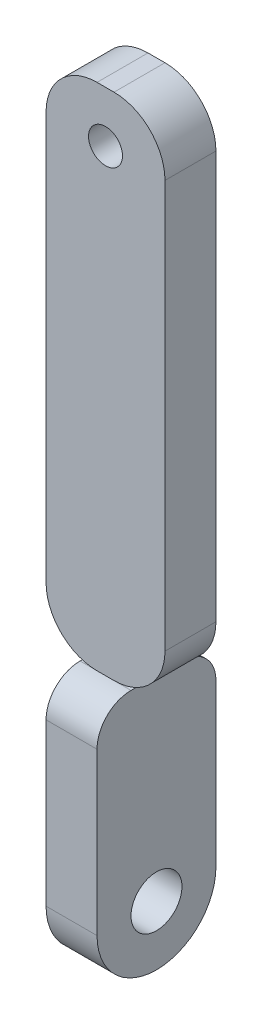
ISO-10303-21;
HEADER;
FILE_DESCRIPTION(('STEP AP214'),'2;1');
FILE_NAME('part.step','',(''),(''),'','','');
FILE_SCHEMA(('AUTOMOTIVE_DESIGN { 1 0 10303 214 1 1 1 1 }'));
ENDSEC;
DATA;
#1=APPLICATION_CONTEXT('core data for automotive mechanical design processes');
#2=APPLICATION_PROTOCOL_DEFINITION('international standard','automotive_design',2000,#1);
#3=PRODUCT_CONTEXT('',#1,'mechanical');
#4=PRODUCT('Part','Part','',(#3));
#5=PRODUCT_RELATED_PRODUCT_CATEGORY('part','',(#4));
#6=PRODUCT_DEFINITION_FORMATION('','',#4);
#7=PRODUCT_DEFINITION_CONTEXT('part definition',#1,'design');
#8=PRODUCT_DEFINITION('design','',#6,#7);
#9=PRODUCT_DEFINITION_SHAPE('','',#8);
#10=(LENGTH_UNIT() NAMED_UNIT(*) SI_UNIT(.MILLI.,.METRE.));
#11=(NAMED_UNIT(*) PLANE_ANGLE_UNIT() SI_UNIT($,.RADIAN.));
#12=(NAMED_UNIT(*) SI_UNIT($,.STERADIAN.) SOLID_ANGLE_UNIT());
#13=UNCERTAINTY_MEASURE_WITH_UNIT(LENGTH_MEASURE(1.E-05),#10,'distance_accuracy_value','');
#14=(GEOMETRIC_REPRESENTATION_CONTEXT(3) GLOBAL_UNCERTAINTY_ASSIGNED_CONTEXT((#13)) GLOBAL_UNIT_ASSIGNED_CONTEXT((#10,
#11,#12)) REPRESENTATION_CONTEXT('',''));
#15=CARTESIAN_POINT('',(0.,0.,0.));
#16=DIRECTION('',(0.,0.,1.));
#17=DIRECTION('',(1.,0.,0.));
#18=AXIS2_PLACEMENT_3D('',#15,#16,#17);
#19=CARTESIAN_POINT('',(0.,-30.,3.5));
#20=DIRECTION('',(0.,1.,0.));
#21=DIRECTION('',(0.,0.,1.));
#22=AXIS2_PLACEMENT_3D('',#19,#20,#21);
#23=PLANE('',#22);
#24=DIRECTION('',(0.,0.,-1.));
#25=VECTOR('',#24,1.);
#26=CARTESIAN_POINT('',(5.,-30.,3.5));
#27=LINE('',#26,#25);
#28=CARTESIAN_POINT('',(5.,-30.,1.5));
#29=VERTEX_POINT('',#28);
#30=CARTESIAN_POINT('',(5.,-30.,-1.5));
#31=VERTEX_POINT('',#30);
#32=EDGE_CURVE('E150',#29,#31,#27,.T.);
#33=ORIENTED_EDGE('',*,*,#32,.T.);
#34=DIRECTION('',(1.,0.,0.));
#35=VECTOR('',#34,1.);
#36=CARTESIAN_POINT('',(2.,-30.,-1.5));
#37=LINE('',#36,#35);
#38=CARTESIAN_POINT('',(4.,-30.,-1.5));
#39=VERTEX_POINT('',#38);
#40=EDGE_CURVE('E145',#31,#39,#37,.F.);
#41=ORIENTED_EDGE('',*,*,#40,.T.);
#42=DIRECTION('',(0.,0.,-1.));
#43=VECTOR('',#42,1.);
#44=CARTESIAN_POINT('',(4.,-30.,1.5));
#45=LINE('',#44,#43);
#46=CARTESIAN_POINT('',(4.,-30.,1.5));
#47=VERTEX_POINT('',#46);
#48=EDGE_CURVE('E147',#47,#39,#45,.T.);
#49=ORIENTED_EDGE('',*,*,#48,.F.);
#50=DIRECTION('',(1.,0.,0.));
#51=VECTOR('',#50,1.);
#52=CARTESIAN_POINT('',(0.,-30.,1.5));
#53=LINE('',#52,#51);
#54=EDGE_CURVE('E206',#47,#29,#53,.T.);
#55=ORIENTED_EDGE('',*,*,#54,.T.);
#56=EDGE_LOOP('',(#33,#41,#49,#55));
#57=FACE_BOUND('',#56,.T.);
#58=ADVANCED_FACE('F35',(#57),#23,.T.);
#59=CARTESIAN_POINT('',(0.,0.,1.5));
#60=DIRECTION('',(0.,1.,0.));
#61=DIRECTION('',(0.,0.,1.));
#62=AXIS2_PLACEMENT_3D('',#59,#60,#61);
#63=PLANE('',#62);
#64=DIRECTION('',(1.,0.,0.));
#65=VECTOR('',#64,1.);
#66=CARTESIAN_POINT('',(0.,0.,-1.5));
#67=LINE('',#66,#65);
#68=CARTESIAN_POINT('',(3.00000000000002,0.,-1.5));
#69=VERTEX_POINT('',#68);
#70=CARTESIAN_POINT('',(4.,0.,-1.5));
#71=VERTEX_POINT('',#70);
#72=EDGE_CURVE('E284',#69,#71,#67,.T.);
#73=ORIENTED_EDGE('',*,*,#72,.F.);
#74=DIRECTION('',(0.,0.,-1.));
#75=VECTOR('',#74,1.);
#76=CARTESIAN_POINT('',(3.00000000000002,0.,1.5));
#77=LINE('',#76,#75);
#78=CARTESIAN_POINT('',(3.00000000000002,0.,1.5));
#79=VERTEX_POINT('',#78);
#80=EDGE_CURVE('E204',#79,#69,#77,.T.);
#81=ORIENTED_EDGE('',*,*,#80,.F.);
#82=DIRECTION('',(1.,0.,0.));
#83=VECTOR('',#82,1.);
#84=CARTESIAN_POINT('',(0.,0.,1.5));
#85=LINE('',#84,#83);
#86=CARTESIAN_POINT('',(4.,0.,1.5));
#87=VERTEX_POINT('',#86);
#88=EDGE_CURVE('E262',#79,#87,#85,.T.);
#89=ORIENTED_EDGE('',*,*,#88,.T.);
#90=DIRECTION('',(0.,0.,-1.));
#91=VECTOR('',#90,1.);
#92=CARTESIAN_POINT('',(4.,0.,1.5));
#93=LINE('',#92,#91);
#94=EDGE_CURVE('E190',#87,#71,#93,.T.);
#95=ORIENTED_EDGE('',*,*,#94,.T.);
#96=EDGE_LOOP('',(#73,#81,#89,#95));
#97=FACE_BOUND('',#96,.T.);
#98=ADVANCED_FACE('F306',(#97),#63,.T.);
#99=CARTESIAN_POINT('',(3.,-3.,1.5));
#100=DIRECTION('',(0.,0.,-1.));
#101=DIRECTION('',(-1.,0.,0.));
#102=AXIS2_PLACEMENT_3D('',#99,#100,#101);
#103=CYLINDRICAL_SURFACE('',#102,3.);
#104=CARTESIAN_POINT('',(3.,-3.,-1.5));
#105=DIRECTION('',(0.,0.,1.));
#106=DIRECTION('',(1.,0.,0.));
#107=AXIS2_PLACEMENT_3D('',#104,#105,#106);
#108=CIRCLE('',#107,3.);
#109=CARTESIAN_POINT('',(0.,-3.00000000000002,-1.5));
#110=VERTEX_POINT('',#109);
#111=EDGE_CURVE('E286',#69,#110,#108,.T.);
#112=ORIENTED_EDGE('',*,*,#111,.T.);
#113=DIRECTION('',(0.,0.,-1.));
#114=VECTOR('',#113,1.);
#115=CARTESIAN_POINT('',(0.,-3.00000000000002,1.5));
#116=LINE('',#115,#114);
#117=CARTESIAN_POINT('',(0.,-3.00000000000002,1.5));
#118=VERTEX_POINT('',#117);
#119=EDGE_CURVE('E201',#118,#110,#116,.T.);
#120=ORIENTED_EDGE('',*,*,#119,.F.);
#121=CARTESIAN_POINT('',(3.,-3.,1.5));
#122=DIRECTION('',(0.,0.,1.));
#123=DIRECTION('',(1.,0.,0.));
#124=AXIS2_PLACEMENT_3D('',#121,#122,#123);
#125=CIRCLE('',#124,3.);
#126=EDGE_CURVE('E265',#79,#118,#125,.T.);
#127=ORIENTED_EDGE('',*,*,#126,.F.);
#128=ORIENTED_EDGE('',*,*,#80,.T.);
#129=EDGE_LOOP('',(#112,#120,#127,#128));
#130=FACE_BOUND('',#129,.T.);
#131=ADVANCED_FACE('F304',(#130),#103,.T.);
#132=CARTESIAN_POINT('',(0.,0.,1.5));
#133=DIRECTION('',(1.,0.,0.));
#134=DIRECTION('',(0.,1.,0.));
#135=AXIS2_PLACEMENT_3D('',#132,#133,#134);
#136=PLANE('',#135);
#137=DIRECTION('',(0.,-1.,0.));
#138=VECTOR('',#137,1.);
#139=CARTESIAN_POINT('',(0.,0.,-1.5));
#140=LINE('',#139,#138);
#141=CARTESIAN_POINT('',(0.,-27.,-1.5));
#142=VERTEX_POINT('',#141);
#143=EDGE_CURVE('E182',#110,#142,#140,.T.);
#144=ORIENTED_EDGE('',*,*,#143,.T.);
#145=DIRECTION('',(0.,0.,-1.));
#146=VECTOR('',#145,1.);
#147=CARTESIAN_POINT('',(0.,-27.,1.5));
#148=LINE('',#147,#146);
#149=CARTESIAN_POINT('',(0.,-27.,1.5));
#150=VERTEX_POINT('',#149);
#151=EDGE_CURVE('E198',#150,#142,#148,.T.);
#152=ORIENTED_EDGE('',*,*,#151,.F.);
#153=DIRECTION('',(0.,-1.,0.));
#154=VECTOR('',#153,1.);
#155=CARTESIAN_POINT('',(0.,0.,1.5));
#156=LINE('',#155,#154);
#157=EDGE_CURVE('E268',#118,#150,#156,.T.);
#158=ORIENTED_EDGE('',*,*,#157,.F.);
#159=ORIENTED_EDGE('',*,*,#119,.T.);
#160=EDGE_LOOP('',(#144,#152,#158,#159));
#161=FACE_BOUND('',#160,.T.);
#162=ADVANCED_FACE('F291',(#161),#136,.F.);
#163=CARTESIAN_POINT('',(3.,-27.,1.5));
#164=DIRECTION('',(0.,0.,-1.));
#165=DIRECTION('',(-1.,0.,0.));
#166=AXIS2_PLACEMENT_3D('',#163,#164,#165);
#167=CYLINDRICAL_SURFACE('',#166,3.);
#168=CARTESIAN_POINT('',(3.,-27.,-1.5));
#169=DIRECTION('',(0.,0.,1.));
#170=DIRECTION('',(1.,0.,0.));
#171=AXIS2_PLACEMENT_3D('',#168,#169,#170);
#172=CIRCLE('',#171,3.);
#173=CARTESIAN_POINT('',(3.,-30.,-1.5));
#174=VERTEX_POINT('',#173);
#175=EDGE_CURVE('E180',#142,#174,#172,.T.);
#176=ORIENTED_EDGE('',*,*,#175,.T.);
#177=DIRECTION('',(0.,0.,-1.));
#178=VECTOR('',#177,1.);
#179=CARTESIAN_POINT('',(3.,-30.,1.5));
#180=LINE('',#179,#178);
#181=CARTESIAN_POINT('',(3.,-30.,1.5));
#182=VERTEX_POINT('',#181);
#183=EDGE_CURVE('E165',#182,#174,#180,.T.);
#184=ORIENTED_EDGE('',*,*,#183,.F.);
#185=CARTESIAN_POINT('',(3.,-27.,1.5));
#186=DIRECTION('',(0.,0.,1.));
#187=DIRECTION('',(1.,0.,0.));
#188=AXIS2_PLACEMENT_3D('',#185,#186,#187);
#189=CIRCLE('',#188,3.);
#190=EDGE_CURVE('E271',#150,#182,#189,.T.);
#191=ORIENTED_EDGE('',*,*,#190,.F.);
#192=ORIENTED_EDGE('',*,*,#151,.T.);
#193=EDGE_LOOP('',(#176,#184,#191,#192));
#194=FACE_BOUND('',#193,.T.);
#195=ADVANCED_FACE('F297',(#194),#167,.T.);
#196=CARTESIAN_POINT('',(4.,-27.,1.5));
#197=DIRECTION('',(0.,0.,-1.));
#198=DIRECTION('',(-1.,0.,0.));
#199=AXIS2_PLACEMENT_3D('',#196,#197,#198);
#200=CYLINDRICAL_SURFACE('',#199,3.);
#201=CARTESIAN_POINT('',(4.,-27.,-1.5));
#202=DIRECTION('',(0.,0.,1.));
#203=DIRECTION('',(1.,0.,0.));
#204=AXIS2_PLACEMENT_3D('',#201,#202,#203);
#205=CIRCLE('',#204,3.);
#206=CARTESIAN_POINT('',(7.,-27.,-1.5));
#207=VERTEX_POINT('',#206);
#208=EDGE_CURVE('E161',#39,#207,#205,.T.);
#209=ORIENTED_EDGE('',*,*,#208,.T.);
#210=DIRECTION('',(0.,0.,-1.));
#211=VECTOR('',#210,1.);
#212=CARTESIAN_POINT('',(7.,-27.,1.5));
#213=LINE('',#212,#211);
#214=CARTESIAN_POINT('',(7.,-27.,1.5));
#215=VERTEX_POINT('',#214);
#216=EDGE_CURVE('E166',#215,#207,#213,.T.);
#217=ORIENTED_EDGE('',*,*,#216,.F.);
#218=CARTESIAN_POINT('',(4.,-27.,1.5));
#219=DIRECTION('',(0.,0.,1.));
#220=DIRECTION('',(1.,0.,0.));
#221=AXIS2_PLACEMENT_3D('',#218,#219,#220);
#222=CIRCLE('',#221,3.);
#223=EDGE_CURVE('E163',#47,#215,#222,.T.);
#224=ORIENTED_EDGE('',*,*,#223,.F.);
#225=ORIENTED_EDGE('',*,*,#48,.T.);
#226=EDGE_LOOP('',(#209,#217,#224,#225));
#227=FACE_BOUND('',#226,.T.);
#228=ADVANCED_FACE('F159',(#227),#200,.T.);
#229=CARTESIAN_POINT('',(7.,0.,1.5));
#230=DIRECTION('',(1.,0.,0.));
#231=DIRECTION('',(0.,1.,0.));
#232=AXIS2_PLACEMENT_3D('',#229,#230,#231);
#233=PLANE('',#232);
#234=DIRECTION('',(0.,-1.,0.));
#235=VECTOR('',#234,1.);
#236=CARTESIAN_POINT('',(7.,0.,-1.5));
#237=LINE('',#236,#235);
#238=CARTESIAN_POINT('',(7.,-3.,-1.5));
#239=VERTEX_POINT('',#238);
#240=EDGE_CURVE('E175',#239,#207,#237,.T.);
#241=ORIENTED_EDGE('',*,*,#240,.F.);
#242=DIRECTION('',(0.,0.,-1.));
#243=VECTOR('',#242,1.);
#244=CARTESIAN_POINT('',(7.,-3.,1.5));
#245=LINE('',#244,#243);
#246=CARTESIAN_POINT('',(7.,-3.,1.5));
#247=VERTEX_POINT('',#246);
#248=EDGE_CURVE('E192',#247,#239,#245,.T.);
#249=ORIENTED_EDGE('',*,*,#248,.F.);
#250=DIRECTION('',(0.,-1.,0.));
#251=VECTOR('',#250,1.);
#252=CARTESIAN_POINT('',(7.,0.,1.5));
#253=LINE('',#252,#251);
#254=EDGE_CURVE('E277',#247,#215,#253,.T.);
#255=ORIENTED_EDGE('',*,*,#254,.T.);
#256=ORIENTED_EDGE('',*,*,#216,.T.);
#257=EDGE_LOOP('',(#241,#249,#255,#256));
#258=FACE_BOUND('',#257,.T.);
#259=ADVANCED_FACE('F312',(#258),#233,.T.);
#260=CARTESIAN_POINT('',(3.5,-3.,1.5));
#261=DIRECTION('',(0.,0.,-1.));
#262=DIRECTION('',(-1.,0.,0.));
#263=AXIS2_PLACEMENT_3D('',#260,#261,#262);
#264=CYLINDRICAL_SURFACE('',#263,0.999999999999999);
#265=CARTESIAN_POINT('',(3.5,-3.,1.5));
#266=DIRECTION('',(0.,0.,1.));
#267=DIRECTION('',(1.,0.,0.));
#268=AXIS2_PLACEMENT_3D('',#265,#266,#267);
#269=CIRCLE('',#268,0.999999999999999);
#270=CARTESIAN_POINT('',(4.5,-3.,1.5));
#271=VERTEX_POINT('',#270);
#272=EDGE_CURVE('E189',#271,#271,#269,.T.);
#273=ORIENTED_EDGE('',*,*,#272,.T.);
#274=EDGE_LOOP('',(#273));
#275=FACE_BOUND('',#274,.T.);
#276=CARTESIAN_POINT('',(3.5,-3.,-1.5));
#277=DIRECTION('',(0.,0.,1.));
#278=DIRECTION('',(1.,0.,0.));
#279=AXIS2_PLACEMENT_3D('',#276,#277,#278);
#280=CIRCLE('',#279,0.999999999999999);
#281=CARTESIAN_POINT('',(4.5,-3.,-1.5));
#282=VERTEX_POINT('',#281);
#283=EDGE_CURVE('E259',#282,#282,#280,.T.);
#284=ORIENTED_EDGE('',*,*,#283,.F.);
#285=EDGE_LOOP('',(#284));
#286=FACE_BOUND('',#285,.T.);
#287=ADVANCED_FACE('F368',(#275,#286),#264,.F.);
#288=CARTESIAN_POINT('',(4.,-3.,1.5));
#289=DIRECTION('',(0.,0.,-1.));
#290=DIRECTION('',(-1.,0.,0.));
#291=AXIS2_PLACEMENT_3D('',#288,#289,#290);
#292=CYLINDRICAL_SURFACE('',#291,3.);
#293=CARTESIAN_POINT('',(4.,-3.,-1.5));
#294=DIRECTION('',(0.,0.,1.));
#295=DIRECTION('',(1.,0.,0.));
#296=AXIS2_PLACEMENT_3D('',#293,#294,#295);
#297=CIRCLE('',#296,3.);
#298=EDGE_CURVE('E187',#71,#239,#297,.F.);
#299=ORIENTED_EDGE('',*,*,#298,.F.);
#300=ORIENTED_EDGE('',*,*,#94,.F.);
#301=CARTESIAN_POINT('',(4.,-3.,1.5));
#302=DIRECTION('',(0.,0.,1.));
#303=DIRECTION('',(1.,0.,0.));
#304=AXIS2_PLACEMENT_3D('',#301,#302,#303);
#305=CIRCLE('',#304,3.);
#306=EDGE_CURVE('E193',#87,#247,#305,.F.);
#307=ORIENTED_EDGE('',*,*,#306,.T.);
#308=ORIENTED_EDGE('',*,*,#248,.T.);
#309=EDGE_LOOP('',(#299,#300,#307,#308));
#310=FACE_BOUND('',#309,.T.);
#311=ADVANCED_FACE('F309',(#310),#292,.T.);
#312=CARTESIAN_POINT('',(0.,0.,1.5));
#313=DIRECTION('',(0.,0.,1.));
#314=DIRECTION('',(1.,0.,0.));
#315=AXIS2_PLACEMENT_3D('',#312,#313,#314);
#316=PLANE('',#315);
#317=ORIENTED_EDGE('',*,*,#272,.F.);
#318=EDGE_LOOP('',(#317));
#319=FACE_BOUND('',#318,.T.);
#320=ORIENTED_EDGE('',*,*,#88,.F.);
#321=ORIENTED_EDGE('',*,*,#126,.T.);
#322=ORIENTED_EDGE('',*,*,#157,.T.);
#323=ORIENTED_EDGE('',*,*,#190,.T.);
#324=DIRECTION('',(1.,0.,0.));
#325=VECTOR('',#324,1.);
#326=CARTESIAN_POINT('',(0.,-30.,1.5));
#327=LINE('',#326,#325);
#328=EDGE_CURVE('E274',#182,#47,#327,.T.);
#329=ORIENTED_EDGE('',*,*,#328,.T.);
#330=ORIENTED_EDGE('',*,*,#223,.T.);
#331=ORIENTED_EDGE('',*,*,#254,.F.);
#332=ORIENTED_EDGE('',*,*,#306,.F.);
#333=EDGE_LOOP('',(#320,#321,#322,#323,#329,#330,#331,#332));
#334=FACE_BOUND('',#333,.T.);
#335=ADVANCED_FACE('F300',(#319,#334),#316,.T.);
#336=CARTESIAN_POINT('',(0.,0.,-1.5));
#337=DIRECTION('',(0.,0.,1.));
#338=DIRECTION('',(1.,0.,0.));
#339=AXIS2_PLACEMENT_3D('',#336,#337,#338);
#340=PLANE('',#339);
#341=ORIENTED_EDGE('',*,*,#283,.T.);
#342=EDGE_LOOP('',(#341));
#343=FACE_BOUND('',#342,.T.);
#344=ORIENTED_EDGE('',*,*,#72,.T.);
#345=ORIENTED_EDGE('',*,*,#298,.T.);
#346=ORIENTED_EDGE('',*,*,#240,.T.);
#347=ORIENTED_EDGE('',*,*,#208,.F.);
#348=DIRECTION('',(1.,0.,0.));
#349=VECTOR('',#348,1.);
#350=CARTESIAN_POINT('',(0.,-30.,-1.5));
#351=LINE('',#350,#349);
#352=EDGE_CURVE('E171',#174,#39,#351,.T.);
#353=ORIENTED_EDGE('',*,*,#352,.F.);
#354=ORIENTED_EDGE('',*,*,#175,.F.);
#355=ORIENTED_EDGE('',*,*,#143,.F.);
#356=ORIENTED_EDGE('',*,*,#111,.F.);
#357=EDGE_LOOP('',(#344,#345,#346,#347,#353,#354,#355,#356));
#358=FACE_BOUND('',#357,.T.);
#359=ADVANCED_FACE('F170',(#343,#358),#340,.F.);
#360=CARTESIAN_POINT('',(5.,0.,3.5));
#361=DIRECTION('',(1.,0.,0.));
#362=DIRECTION('',(0.,1.,0.));
#363=AXIS2_PLACEMENT_3D('',#360,#361,#362);
#364=PLANE('',#363);
#365=CARTESIAN_POINT('',(5.,-41.5,0.));
#366=DIRECTION('',(1.,0.,0.));
#367=DIRECTION('',(0.,1.,0.));
#368=AXIS2_PLACEMENT_3D('',#365,#366,#367);
#369=CIRCLE('',#368,1.5);
#370=CARTESIAN_POINT('',(5.,-40.,0.));
#371=VERTEX_POINT('',#370);
#372=EDGE_CURVE('E240',#371,#371,#369,.T.);
#373=ORIENTED_EDGE('',*,*,#372,.F.);
#374=EDGE_LOOP('',(#373));
#375=FACE_BOUND('',#374,.T.);
#376=DIRECTION('',(0.,-1.,0.));
#377=VECTOR('',#376,1.);
#378=CARTESIAN_POINT('',(5.,0.,3.5));
#379=LINE('',#378,#377);
#380=CARTESIAN_POINT('',(5.,-32.,3.5));
#381=VERTEX_POINT('',#380);
#382=CARTESIAN_POINT('',(5.,-41.5,3.5));
#383=VERTEX_POINT('',#382);
#384=EDGE_CURVE('E248',#381,#383,#379,.T.);
#385=ORIENTED_EDGE('',*,*,#384,.T.);
#386=CARTESIAN_POINT('',(5.,-41.5,0.));
#387=DIRECTION('',(1.,0.,0.));
#388=DIRECTION('',(0.,1.,0.));
#389=AXIS2_PLACEMENT_3D('',#386,#387,#388);
#390=CIRCLE('',#389,3.5);
#391=CARTESIAN_POINT('',(5.,-45.,0.));
#392=VERTEX_POINT('',#391);
#393=EDGE_CURVE('E229',#383,#392,#390,.T.);
#394=ORIENTED_EDGE('',*,*,#393,.T.);
#395=CARTESIAN_POINT('',(5.,-41.5,0.));
#396=DIRECTION('',(1.,0.,0.));
#397=DIRECTION('',(0.,1.,0.));
#398=AXIS2_PLACEMENT_3D('',#395,#396,#397);
#399=CIRCLE('',#398,3.5);
#400=CARTESIAN_POINT('',(5.,-41.5,-3.5));
#401=VERTEX_POINT('',#400);
#402=EDGE_CURVE('E227',#392,#401,#399,.T.);
#403=ORIENTED_EDGE('',*,*,#402,.T.);
#404=DIRECTION('',(0.,-1.,0.));
#405=VECTOR('',#404,1.);
#406=CARTESIAN_POINT('',(5.,0.,-3.5));
#407=LINE('',#406,#405);
#408=CARTESIAN_POINT('',(5.,-32.,-3.5));
#409=VERTEX_POINT('',#408);
#410=EDGE_CURVE('E234',#409,#401,#407,.T.);
#411=ORIENTED_EDGE('',*,*,#410,.F.);
#412=CARTESIAN_POINT('',(5.,-32.,-1.5));
#413=DIRECTION('',(1.,0.,0.));
#414=DIRECTION('',(0.,1.,0.));
#415=AXIS2_PLACEMENT_3D('',#412,#413,#414);
#416=CIRCLE('',#415,2.);
#417=EDGE_CURVE('E220',#409,#31,#416,.T.);
#418=ORIENTED_EDGE('',*,*,#417,.T.);
#419=ORIENTED_EDGE('',*,*,#32,.F.);
#420=CARTESIAN_POINT('',(5.,-32.,1.5));
#421=DIRECTION('',(1.,0.,0.));
#422=DIRECTION('',(0.,1.,0.));
#423=AXIS2_PLACEMENT_3D('',#420,#421,#422);
#424=CIRCLE('',#423,2.);
#425=EDGE_CURVE('E211',#29,#381,#424,.T.);
#426=ORIENTED_EDGE('',*,*,#425,.T.);
#427=EDGE_LOOP('',(#385,#394,#403,#411,#418,#419,#426));
#428=FACE_BOUND('',#427,.T.);
#429=ADVANCED_FACE('F327',(#375,#428),#364,.T.);
#430=ORIENTED_EDGE('',*,*,#183,.T.);
#431=DIRECTION('',(1.,0.,0.));
#432=VECTOR('',#431,1.);
#433=CARTESIAN_POINT('',(2.,-30.,-1.5));
#434=LINE('',#433,#432);
#435=CARTESIAN_POINT('',(2.,-30.,-1.5));
#436=VERTEX_POINT('',#435);
#437=EDGE_CURVE('E154',#174,#436,#434,.F.);
#438=ORIENTED_EDGE('',*,*,#437,.T.);
#439=DIRECTION('',(0.,0.,-1.));
#440=VECTOR('',#439,1.);
#441=CARTESIAN_POINT('',(2.,-30.,3.5));
#442=LINE('',#441,#440);
#443=CARTESIAN_POINT('',(2.,-30.,1.5));
#444=VERTEX_POINT('',#443);
#445=EDGE_CURVE('E253',#444,#436,#442,.T.);
#446=ORIENTED_EDGE('',*,*,#445,.F.);
#447=DIRECTION('',(1.,0.,0.));
#448=VECTOR('',#447,1.);
#449=CARTESIAN_POINT('',(0.,-30.,1.5));
#450=LINE('',#449,#448);
#451=EDGE_CURVE('E208',#444,#182,#450,.T.);
#452=ORIENTED_EDGE('',*,*,#451,.T.);
#453=EDGE_LOOP('',(#430,#438,#446,#452));
#454=FACE_BOUND('',#453,.T.);
#455=ADVANCED_FACE('F320',(#454),#23,.T.);
#456=CARTESIAN_POINT('',(2.,0.,3.5));
#457=DIRECTION('',(1.,0.,0.));
#458=DIRECTION('',(0.,1.,0.));
#459=AXIS2_PLACEMENT_3D('',#456,#457,#458);
#460=PLANE('',#459);
#461=CARTESIAN_POINT('',(2.,-41.5,0.));
#462=DIRECTION('',(1.,0.,0.));
#463=DIRECTION('',(0.,1.,0.));
#464=AXIS2_PLACEMENT_3D('',#461,#462,#463);
#465=CIRCLE('',#464,1.5);
#466=CARTESIAN_POINT('',(2.,-40.,0.));
#467=VERTEX_POINT('',#466);
#468=EDGE_CURVE('E39',#467,#467,#465,.T.);
#469=ORIENTED_EDGE('',*,*,#468,.T.);
#470=EDGE_LOOP('',(#469));
#471=FACE_BOUND('',#470,.T.);
#472=CARTESIAN_POINT('',(2.,-41.5,0.));
#473=DIRECTION('',(1.,0.,0.));
#474=DIRECTION('',(0.,1.,0.));
#475=AXIS2_PLACEMENT_3D('',#472,#473,#474);
#476=CIRCLE('',#475,3.5);
#477=CARTESIAN_POINT('',(2.,-41.5,-3.5));
#478=VERTEX_POINT('',#477);
#479=CARTESIAN_POINT('',(2.,-45.,0.));
#480=VERTEX_POINT('',#479);
#481=EDGE_CURVE('E52',#478,#480,#476,.F.);
#482=ORIENTED_EDGE('',*,*,#481,.T.);
#483=CARTESIAN_POINT('',(2.,-41.5,0.));
#484=DIRECTION('',(1.,0.,0.));
#485=DIRECTION('',(0.,1.,0.));
#486=AXIS2_PLACEMENT_3D('',#483,#484,#485);
#487=CIRCLE('',#486,3.5);
#488=CARTESIAN_POINT('',(2.,-41.5,3.5));
#489=VERTEX_POINT('',#488);
#490=EDGE_CURVE('E44',#480,#489,#487,.F.);
#491=ORIENTED_EDGE('',*,*,#490,.T.);
#492=DIRECTION('',(0.,-1.,0.));
#493=VECTOR('',#492,1.);
#494=CARTESIAN_POINT('',(2.,0.,3.5));
#495=LINE('',#494,#493);
#496=CARTESIAN_POINT('',(2.,-32.,3.5));
#497=VERTEX_POINT('',#496);
#498=EDGE_CURVE('E251',#497,#489,#495,.T.);
#499=ORIENTED_EDGE('',*,*,#498,.F.);
#500=CARTESIAN_POINT('',(2.,-32.,1.5));
#501=DIRECTION('',(1.,0.,0.));
#502=DIRECTION('',(0.,1.,0.));
#503=AXIS2_PLACEMENT_3D('',#500,#501,#502);
#504=CIRCLE('',#503,2.);
#505=EDGE_CURVE('E215',#497,#444,#504,.F.);
#506=ORIENTED_EDGE('',*,*,#505,.T.);
#507=ORIENTED_EDGE('',*,*,#445,.T.);
#508=CARTESIAN_POINT('',(2.,-32.,-1.5));
#509=DIRECTION('',(1.,0.,0.));
#510=DIRECTION('',(0.,1.,0.));
#511=AXIS2_PLACEMENT_3D('',#508,#509,#510);
#512=CIRCLE('',#511,2.);
#513=CARTESIAN_POINT('',(2.,-32.,-3.5));
#514=VERTEX_POINT('',#513);
#515=EDGE_CURVE('E153',#436,#514,#512,.F.);
#516=ORIENTED_EDGE('',*,*,#515,.T.);
#517=DIRECTION('',(0.,-1.,0.));
#518=VECTOR('',#517,1.);
#519=CARTESIAN_POINT('',(2.,0.,-3.5));
#520=LINE('',#519,#518);
#521=EDGE_CURVE('E237',#514,#478,#520,.T.);
#522=ORIENTED_EDGE('',*,*,#521,.T.);
#523=EDGE_LOOP('',(#482,#491,#499,#506,#507,#516,#522));
#524=FACE_BOUND('',#523,.T.);
#525=ADVANCED_FACE('F321',(#471,#524),#460,.F.);
#526=CARTESIAN_POINT('',(0.,0.,3.5));
#527=DIRECTION('',(0.,0.,1.));
#528=DIRECTION('',(1.,0.,0.));
#529=AXIS2_PLACEMENT_3D('',#526,#527,#528);
#530=PLANE('',#529);
#531=ORIENTED_EDGE('',*,*,#498,.T.);
#532=DIRECTION('',(1.,0.,0.));
#533=VECTOR('',#532,1.);
#534=CARTESIAN_POINT('',(5.,-41.5,3.5));
#535=LINE('',#534,#533);
#536=EDGE_CURVE('E224',#489,#383,#535,.T.);
#537=ORIENTED_EDGE('',*,*,#536,.T.);
#538=ORIENTED_EDGE('',*,*,#384,.F.);
#539=DIRECTION('',(1.,0.,0.));
#540=VECTOR('',#539,1.);
#541=CARTESIAN_POINT('',(0.,-32.,3.5));
#542=LINE('',#541,#540);
#543=EDGE_CURVE('E213',#381,#497,#542,.F.);
#544=ORIENTED_EDGE('',*,*,#543,.T.);
#545=EDGE_LOOP('',(#531,#537,#538,#544));
#546=FACE_BOUND('',#545,.T.);
#547=ADVANCED_FACE('F333',(#546),#530,.T.);
#548=CARTESIAN_POINT('',(0.,0.,-3.5));
#549=DIRECTION('',(0.,0.,1.));
#550=DIRECTION('',(1.,0.,0.));
#551=AXIS2_PLACEMENT_3D('',#548,#549,#550);
#552=PLANE('',#551);
#553=ORIENTED_EDGE('',*,*,#410,.T.);
#554=DIRECTION('',(1.,0.,0.));
#555=VECTOR('',#554,1.);
#556=CARTESIAN_POINT('',(0.,-41.5,-3.5));
#557=LINE('',#556,#555);
#558=EDGE_CURVE('E11',#401,#478,#557,.F.);
#559=ORIENTED_EDGE('',*,*,#558,.T.);
#560=ORIENTED_EDGE('',*,*,#521,.F.);
#561=DIRECTION('',(1.,0.,0.));
#562=VECTOR('',#561,1.);
#563=CARTESIAN_POINT('',(5.,-32.,-3.5));
#564=LINE('',#563,#562);
#565=EDGE_CURVE('E217',#514,#409,#564,.T.);
#566=ORIENTED_EDGE('',*,*,#565,.T.);
#567=EDGE_LOOP('',(#553,#559,#560,#566));
#568=FACE_BOUND('',#567,.T.);
#569=ADVANCED_FACE('F325',(#568),#552,.F.);
#570=CARTESIAN_POINT('',(0.,-32.,1.5));
#571=DIRECTION('',(1.,0.,0.));
#572=DIRECTION('',(0.,0.,-1.));
#573=AXIS2_PLACEMENT_3D('',#570,#571,#572);
#574=CYLINDRICAL_SURFACE('',#573,2.);
#575=ORIENTED_EDGE('',*,*,#505,.F.);
#576=ORIENTED_EDGE('',*,*,#543,.F.);
#577=ORIENTED_EDGE('',*,*,#425,.F.);
#578=ORIENTED_EDGE('',*,*,#54,.F.);
#579=ORIENTED_EDGE('',*,*,#328,.F.);
#580=ORIENTED_EDGE('',*,*,#451,.F.);
#581=EDGE_LOOP('',(#575,#576,#577,#578,#579,#580));
#582=FACE_BOUND('',#581,.T.);
#583=ADVANCED_FACE('F316',(#582),#574,.T.);
#584=CARTESIAN_POINT('',(0.,-32.,-1.5));
#585=DIRECTION('',(-1.,0.,0.));
#586=DIRECTION('',(0.,0.,1.));
#587=AXIS2_PLACEMENT_3D('',#584,#585,#586);
#588=CYLINDRICAL_SURFACE('',#587,2.);
#589=ORIENTED_EDGE('',*,*,#352,.T.);
#590=ORIENTED_EDGE('',*,*,#40,.F.);
#591=ORIENTED_EDGE('',*,*,#417,.F.);
#592=ORIENTED_EDGE('',*,*,#565,.F.);
#593=ORIENTED_EDGE('',*,*,#515,.F.);
#594=ORIENTED_EDGE('',*,*,#437,.F.);
#595=EDGE_LOOP('',(#589,#590,#591,#592,#593,#594));
#596=FACE_BOUND('',#595,.T.);
#597=ADVANCED_FACE('F178',(#596),#588,.T.);
#598=CARTESIAN_POINT('',(0.,-41.5,0.));
#599=DIRECTION('',(1.,0.,0.));
#600=DIRECTION('',(0.,1.,0.));
#601=AXIS2_PLACEMENT_3D('',#598,#599,#600);
#602=CYLINDRICAL_SURFACE('',#601,3.5);
#603=DIRECTION('',(1.,0.,0.));
#604=VECTOR('',#603,1.);
#605=CARTESIAN_POINT('',(1.04083408558608E-13,-45.,0.));
#606=LINE('',#605,#604);
#607=EDGE_CURVE('E232',#480,#392,#606,.T.);
#608=ORIENTED_EDGE('',*,*,#607,.F.);
#609=ORIENTED_EDGE('',*,*,#481,.F.);
#610=ORIENTED_EDGE('',*,*,#558,.F.);
#611=ORIENTED_EDGE('',*,*,#402,.F.);
#612=EDGE_LOOP('',(#608,#609,#610,#611));
#613=FACE_BOUND('',#612,.T.);
#614=ADVANCED_FACE('F37',(#613),#602,.T.);
#615=CARTESIAN_POINT('',(0.,-41.5,0.));
#616=DIRECTION('',(-1.,0.,0.));
#617=DIRECTION('',(0.,-1.,0.));
#618=AXIS2_PLACEMENT_3D('',#615,#616,#617);
#619=CYLINDRICAL_SURFACE('',#618,3.5);
#620=ORIENTED_EDGE('',*,*,#490,.F.);
#621=ORIENTED_EDGE('',*,*,#607,.T.);
#622=ORIENTED_EDGE('',*,*,#393,.F.);
#623=ORIENTED_EDGE('',*,*,#536,.F.);
#624=EDGE_LOOP('',(#620,#621,#622,#623));
#625=FACE_BOUND('',#624,.T.);
#626=ADVANCED_FACE('F331',(#625),#619,.T.);
#627=CARTESIAN_POINT('',(-2.,-41.5,0.));
#628=DIRECTION('',(1.,0.,0.));
#629=DIRECTION('',(0.,1.,0.));
#630=AXIS2_PLACEMENT_3D('',#627,#628,#629);
#631=CYLINDRICAL_SURFACE('',#630,1.5);
#632=ORIENTED_EDGE('',*,*,#372,.T.);
#633=EDGE_LOOP('',(#632));
#634=FACE_BOUND('',#633,.T.);
#635=ORIENTED_EDGE('',*,*,#468,.F.);
#636=EDGE_LOOP('',(#635));
#637=FACE_BOUND('',#636,.T.);
#638=ADVANCED_FACE('F386',(#634,#637),#631,.F.);
#639=CLOSED_SHELL('',(#58,#98,#131,#162,#195,#228,#259,#287,#311,#335,#359,#429,#455,#525,#547,
#569,#583,#597,#614,#626,#638));
#640=MANIFOLD_SOLID_BREP('B2',#639);
#641=ADVANCED_BREP_SHAPE_REPRESENTATION('',(#18,#640),#14);
#642=SHAPE_DEFINITION_REPRESENTATION(#9,#641);
ENDSEC;
END-ISO-10303-21;
